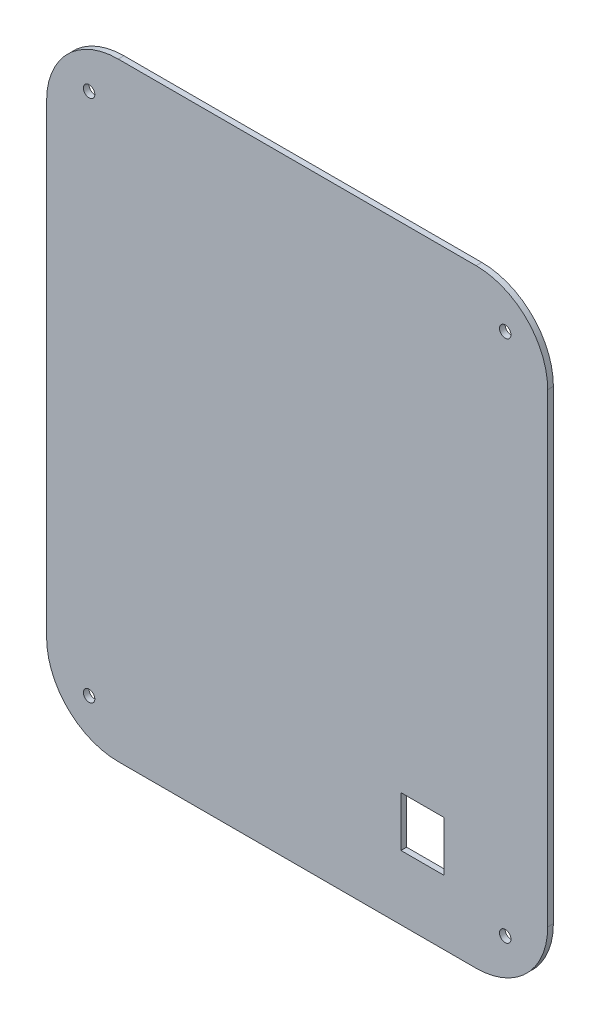
ISO-10303-21;
HEADER;
FILE_DESCRIPTION(('STEP AP214'),'2;1');
FILE_NAME('part.step','',(''),(''),'','','');
FILE_SCHEMA(('AUTOMOTIVE_DESIGN { 1 0 10303 214 1 1 1 1 }'));
ENDSEC;
DATA;
#1=APPLICATION_CONTEXT('core data for automotive mechanical design processes');
#2=APPLICATION_PROTOCOL_DEFINITION('international standard','automotive_design',2000,#1);
#3=PRODUCT_CONTEXT('',#1,'mechanical');
#4=PRODUCT('Part','Part','',(#3));
#5=PRODUCT_RELATED_PRODUCT_CATEGORY('part','',(#4));
#6=PRODUCT_DEFINITION_FORMATION('','',#4);
#7=PRODUCT_DEFINITION_CONTEXT('part definition',#1,'design');
#8=PRODUCT_DEFINITION('design','',#6,#7);
#9=PRODUCT_DEFINITION_SHAPE('','',#8);
#10=(LENGTH_UNIT() NAMED_UNIT(*) SI_UNIT(.MILLI.,.METRE.));
#11=(NAMED_UNIT(*) PLANE_ANGLE_UNIT() SI_UNIT($,.RADIAN.));
#12=(NAMED_UNIT(*) SI_UNIT($,.STERADIAN.) SOLID_ANGLE_UNIT());
#13=UNCERTAINTY_MEASURE_WITH_UNIT(LENGTH_MEASURE(1.E-05),#10,'distance_accuracy_value','');
#14=(GEOMETRIC_REPRESENTATION_CONTEXT(3) GLOBAL_UNCERTAINTY_ASSIGNED_CONTEXT((#13)) GLOBAL_UNIT_ASSIGNED_CONTEXT((#10,
#11,#12)) REPRESENTATION_CONTEXT('',''));
#15=CARTESIAN_POINT('',(0.,0.,0.));
#16=DIRECTION('',(0.,0.,1.));
#17=DIRECTION('',(1.,0.,0.));
#18=AXIS2_PLACEMENT_3D('',#15,#16,#17);
#19=CARTESIAN_POINT('',(52.8773081886998,81.0393473904373,1.5875));
#20=DIRECTION('',(0.,0.,1.));
#21=DIRECTION('',(1.,0.,0.));
#22=AXIS2_PLACEMENT_3D('',#19,#20,#21);
#23=PLANE('',#22);
#24=DIRECTION('',(0.,-1.,0.));
#25=VECTOR('',#24,1.);
#26=CARTESIAN_POINT('',(31.8773081886997,0.,1.5875));
#27=LINE('',#26,#25);
#28=CARTESIAN_POINT('',(31.8773081886997,-36.9606526095627,1.5875));
#29=VERTEX_POINT('',#28);
#30=CARTESIAN_POINT('',(31.8773081886997,-50.9606526095627,1.5875));
#31=VERTEX_POINT('',#30);
#32=EDGE_CURVE('E54',#29,#31,#27,.T.);
#33=ORIENTED_EDGE('',*,*,#32,.F.);
#34=DIRECTION('',(-1.,0.,0.));
#35=VECTOR('',#34,1.);
#36=CARTESIAN_POINT('',(0.,-36.9606526095627,1.5875));
#37=LINE('',#36,#35);
#38=CARTESIAN_POINT('',(43.8773081886997,-36.9606526095627,1.5875));
#39=VERTEX_POINT('',#38);
#40=EDGE_CURVE('E145',#39,#29,#37,.T.);
#41=ORIENTED_EDGE('',*,*,#40,.F.);
#42=DIRECTION('',(0.,-1.,0.));
#43=VECTOR('',#42,1.);
#44=CARTESIAN_POINT('',(43.8773081886997,0.,1.5875));
#45=LINE('',#44,#43);
#46=CARTESIAN_POINT('',(43.8773081886997,-50.9606526095627,1.58750000000002));
#47=VERTEX_POINT('',#46);
#48=EDGE_CURVE('E148',#39,#47,#45,.T.);
#49=ORIENTED_EDGE('',*,*,#48,.T.);
#50=DIRECTION('',(1.,0.,0.));
#51=VECTOR('',#50,1.);
#52=CARTESIAN_POINT('',(0.,-50.9606526095627,1.58750000000002));
#53=LINE('',#52,#51);
#54=EDGE_CURVE('E154',#31,#47,#53,.T.);
#55=ORIENTED_EDGE('',*,*,#54,.F.);
#56=EDGE_LOOP('',(#33,#41,#49,#55));
#57=FACE_BOUND('',#56,.T.);
#58=CARTESIAN_POINT('',(61.0090361723451,89.1710753740826,1.5875));
#59=DIRECTION('',(0.,0.,1.));
#60=DIRECTION('',(1.,0.,0.));
#61=AXIS2_PLACEMENT_3D('',#58,#59,#60);
#62=CIRCLE('',#61,1.60000000000001);
#63=CARTESIAN_POINT('',(62.6090361723451,89.1710753740826,1.5875));
#64=VERTEX_POINT('',#63);
#65=EDGE_CURVE('E170',#64,#64,#62,.T.);
#66=ORIENTED_EDGE('',*,*,#65,.F.);
#67=EDGE_LOOP('',(#66));
#68=FACE_BOUND('',#67,.T.);
#69=CARTESIAN_POINT('',(-55.2544197949455,-57.092380593208,1.5875));
#70=DIRECTION('',(0.,0.,1.));
#71=DIRECTION('',(1.,0.,0.));
#72=AXIS2_PLACEMENT_3D('',#69,#70,#71);
#73=CIRCLE('',#72,1.60000000000001);
#74=CARTESIAN_POINT('',(-53.6544197949455,-57.092380593208,1.5875));
#75=VERTEX_POINT('',#74);
#76=EDGE_CURVE('E182',#75,#75,#73,.T.);
#77=ORIENTED_EDGE('',*,*,#76,.F.);
#78=EDGE_LOOP('',(#77));
#79=FACE_BOUND('',#78,.T.);
#80=CARTESIAN_POINT('',(52.8773081886998,81.0393473904373,1.5875));
#81=DIRECTION('',(0.,0.,1.));
#82=DIRECTION('',(1.,0.,0.));
#83=AXIS2_PLACEMENT_3D('',#80,#81,#82);
#84=CIRCLE('',#83,20.);
#85=CARTESIAN_POINT('',(72.8773081886998,81.0393473904373,1.5875));
#86=VERTEX_POINT('',#85);
#87=CARTESIAN_POINT('',(52.8773081886998,101.039347390437,1.5875));
#88=VERTEX_POINT('',#87);
#89=EDGE_CURVE('E188',#86,#88,#84,.T.);
#90=ORIENTED_EDGE('',*,*,#89,.T.);
#91=DIRECTION('',(-1.,0.,0.));
#92=VECTOR('',#91,1.);
#93=CARTESIAN_POINT('',(52.8773081886998,101.039347390437,1.5875));
#94=LINE('',#93,#92);
#95=CARTESIAN_POINT('',(-47.1226918113002,101.039347390437,1.5875));
#96=VERTEX_POINT('',#95);
#97=EDGE_CURVE('E191',#88,#96,#94,.T.);
#98=ORIENTED_EDGE('',*,*,#97,.T.);
#99=CARTESIAN_POINT('',(-47.1226918113002,81.0393473904373,1.5875));
#100=DIRECTION('',(0.,0.,1.));
#101=DIRECTION('',(1.,0.,0.));
#102=AXIS2_PLACEMENT_3D('',#99,#100,#101);
#103=CIRCLE('',#102,20.);
#104=CARTESIAN_POINT('',(-67.1226918113002,81.0393473904373,1.5875));
#105=VERTEX_POINT('',#104);
#106=EDGE_CURVE('E194',#96,#105,#103,.T.);
#107=ORIENTED_EDGE('',*,*,#106,.T.);
#108=DIRECTION('',(0.,-1.,0.));
#109=VECTOR('',#108,1.);
#110=CARTESIAN_POINT('',(-67.1226918113002,81.0393473904373,1.5875));
#111=LINE('',#110,#109);
#112=CARTESIAN_POINT('',(-67.1226918113003,-48.9606526095627,1.5875));
#113=VERTEX_POINT('',#112);
#114=EDGE_CURVE('E196',#105,#113,#111,.T.);
#115=ORIENTED_EDGE('',*,*,#114,.T.);
#116=CARTESIAN_POINT('',(-47.1226918113003,-48.9606526095627,1.5875));
#117=DIRECTION('',(0.,0.,1.));
#118=DIRECTION('',(1.,0.,0.));
#119=AXIS2_PLACEMENT_3D('',#116,#117,#118);
#120=CIRCLE('',#119,20.);
#121=CARTESIAN_POINT('',(-47.1226918113003,-68.9606526095627,1.5875));
#122=VERTEX_POINT('',#121);
#123=EDGE_CURVE('E198',#113,#122,#120,.T.);
#124=ORIENTED_EDGE('',*,*,#123,.T.);
#125=DIRECTION('',(1.,0.,0.));
#126=VECTOR('',#125,1.);
#127=CARTESIAN_POINT('',(-47.1226918113003,-68.9606526095627,1.5875));
#128=LINE('',#127,#126);
#129=CARTESIAN_POINT('',(52.8773081886997,-68.9606526095627,1.5875));
#130=VERTEX_POINT('',#129);
#131=EDGE_CURVE('E200',#122,#130,#128,.T.);
#132=ORIENTED_EDGE('',*,*,#131,.T.);
#133=CARTESIAN_POINT('',(52.8773081886998,-48.9606526095627,1.5875));
#134=DIRECTION('',(0.,0.,1.));
#135=DIRECTION('',(1.,0.,0.));
#136=AXIS2_PLACEMENT_3D('',#133,#134,#135);
#137=CIRCLE('',#136,20.);
#138=CARTESIAN_POINT('',(72.8773081886998,-48.9606526095627,1.5875));
#139=VERTEX_POINT('',#138);
#140=EDGE_CURVE('E202',#130,#139,#137,.T.);
#141=ORIENTED_EDGE('',*,*,#140,.T.);
#142=DIRECTION('',(0.,1.,0.));
#143=VECTOR('',#142,1.);
#144=CARTESIAN_POINT('',(72.8773081886998,-48.9606526095627,1.5875));
#145=LINE('',#144,#143);
#146=EDGE_CURVE('E204',#139,#86,#145,.T.);
#147=ORIENTED_EDGE('',*,*,#146,.T.);
#148=EDGE_LOOP('',(#90,#98,#107,#115,#124,#132,#141,#147));
#149=FACE_BOUND('',#148,.T.);
#150=CARTESIAN_POINT('',(61.009036172345,-57.092380593208,1.5875));
#151=DIRECTION('',(0.,0.,1.));
#152=DIRECTION('',(1.,0.,0.));
#153=AXIS2_PLACEMENT_3D('',#150,#151,#152);
#154=CIRCLE('',#153,1.60000000000001);
#155=CARTESIAN_POINT('',(62.609036172345,-57.092380593208,1.5875));
#156=VERTEX_POINT('',#155);
#157=EDGE_CURVE('E176',#156,#156,#154,.T.);
#158=ORIENTED_EDGE('',*,*,#157,.F.);
#159=EDGE_LOOP('',(#158));
#160=FACE_BOUND('',#159,.T.);
#161=CARTESIAN_POINT('',(-55.2544197949455,89.1710753740826,1.5875));
#162=DIRECTION('',(0.,0.,1.));
#163=DIRECTION('',(1.,0.,0.));
#164=AXIS2_PLACEMENT_3D('',#161,#162,#163);
#165=CIRCLE('',#164,1.60000000000001);
#166=CARTESIAN_POINT('',(-53.6544197949455,89.1710753740826,1.5875));
#167=VERTEX_POINT('',#166);
#168=EDGE_CURVE('E164',#167,#167,#165,.T.);
#169=ORIENTED_EDGE('',*,*,#168,.F.);
#170=EDGE_LOOP('',(#169));
#171=FACE_BOUND('',#170,.T.);
#172=ADVANCED_FACE('F39',(#57,#68,#79,#149,#160,#171),#23,.T.);
#173=CARTESIAN_POINT('',(52.8773081886998,81.0393473904373,0.));
#174=DIRECTION('',(0.,0.,1.));
#175=DIRECTION('',(1.,0.,0.));
#176=AXIS2_PLACEMENT_3D('',#173,#174,#175);
#177=PLANE('',#176);
#178=DIRECTION('',(-1.,0.,0.));
#179=VECTOR('',#178,1.);
#180=CARTESIAN_POINT('',(0.,-36.9606526095627,0.));
#181=LINE('',#180,#179);
#182=CARTESIAN_POINT('',(43.8773081886997,-36.9606526095627,0.));
#183=VERTEX_POINT('',#182);
#184=CARTESIAN_POINT('',(31.8773081886997,-36.9606526095627,0.));
#185=VERTEX_POINT('',#184);
#186=EDGE_CURVE('E133',#183,#185,#181,.T.);
#187=ORIENTED_EDGE('',*,*,#186,.T.);
#188=DIRECTION('',(0.,-1.,0.));
#189=VECTOR('',#188,1.);
#190=CARTESIAN_POINT('',(31.8773081886997,0.,0.));
#191=LINE('',#190,#189);
#192=CARTESIAN_POINT('',(31.8773081886997,-50.9606526095627,0.));
#193=VERTEX_POINT('',#192);
#194=EDGE_CURVE('E130',#185,#193,#191,.T.);
#195=ORIENTED_EDGE('',*,*,#194,.T.);
#196=DIRECTION('',(1.,0.,0.));
#197=VECTOR('',#196,1.);
#198=CARTESIAN_POINT('',(0.,-50.9606526095627,0.));
#199=LINE('',#198,#197);
#200=CARTESIAN_POINT('',(43.8773081886997,-50.9606526095627,0.));
#201=VERTEX_POINT('',#200);
#202=EDGE_CURVE('E136',#193,#201,#199,.T.);
#203=ORIENTED_EDGE('',*,*,#202,.T.);
#204=DIRECTION('',(0.,-1.,0.));
#205=VECTOR('',#204,1.);
#206=CARTESIAN_POINT('',(43.8773081886997,0.,0.));
#207=LINE('',#206,#205);
#208=EDGE_CURVE('E140',#183,#201,#207,.T.);
#209=ORIENTED_EDGE('',*,*,#208,.F.);
#210=EDGE_LOOP('',(#187,#195,#203,#209));
#211=FACE_BOUND('',#210,.T.);
#212=CARTESIAN_POINT('',(52.8773081886998,81.0393473904373,0.));
#213=DIRECTION('',(0.,0.,1.));
#214=DIRECTION('',(1.,0.,0.));
#215=AXIS2_PLACEMENT_3D('',#212,#213,#214);
#216=CIRCLE('',#215,20.);
#217=CARTESIAN_POINT('',(72.8773081886998,81.0393473904373,0.));
#218=VERTEX_POINT('',#217);
#219=CARTESIAN_POINT('',(52.8773081886998,101.039347390437,0.));
#220=VERTEX_POINT('',#219);
#221=EDGE_CURVE('E185',#218,#220,#216,.T.);
#222=ORIENTED_EDGE('',*,*,#221,.F.);
#223=DIRECTION('',(0.,1.,0.));
#224=VECTOR('',#223,1.);
#225=CARTESIAN_POINT('',(72.8773081886998,-48.9606526095627,0.));
#226=LINE('',#225,#224);
#227=CARTESIAN_POINT('',(72.8773081886998,-48.9606526095627,0.));
#228=VERTEX_POINT('',#227);
#229=EDGE_CURVE('E192',#228,#218,#226,.T.);
#230=ORIENTED_EDGE('',*,*,#229,.F.);
#231=CARTESIAN_POINT('',(52.8773081886998,-48.9606526095627,0.));
#232=DIRECTION('',(0.,0.,1.));
#233=DIRECTION('',(1.,0.,0.));
#234=AXIS2_PLACEMENT_3D('',#231,#232,#233);
#235=CIRCLE('',#234,20.);
#236=CARTESIAN_POINT('',(52.8773081886997,-68.9606526095627,0.));
#237=VERTEX_POINT('',#236);
#238=EDGE_CURVE('E219',#237,#228,#235,.T.);
#239=ORIENTED_EDGE('',*,*,#238,.F.);
#240=DIRECTION('',(1.,0.,0.));
#241=VECTOR('',#240,1.);
#242=CARTESIAN_POINT('',(-47.1226918113003,-68.9606526095627,0.));
#243=LINE('',#242,#241);
#244=CARTESIAN_POINT('',(-47.1226918113003,-68.9606526095627,0.));
#245=VERTEX_POINT('',#244);
#246=EDGE_CURVE('E217',#245,#237,#243,.T.);
#247=ORIENTED_EDGE('',*,*,#246,.F.);
#248=CARTESIAN_POINT('',(-47.1226918113003,-48.9606526095627,0.));
#249=DIRECTION('',(0.,0.,1.));
#250=DIRECTION('',(1.,0.,0.));
#251=AXIS2_PLACEMENT_3D('',#248,#249,#250);
#252=CIRCLE('',#251,20.);
#253=CARTESIAN_POINT('',(-67.1226918113003,-48.9606526095627,0.));
#254=VERTEX_POINT('',#253);
#255=EDGE_CURVE('E215',#254,#245,#252,.T.);
#256=ORIENTED_EDGE('',*,*,#255,.F.);
#257=DIRECTION('',(0.,-1.,0.));
#258=VECTOR('',#257,1.);
#259=CARTESIAN_POINT('',(-67.1226918113002,81.0393473904373,0.));
#260=LINE('',#259,#258);
#261=CARTESIAN_POINT('',(-67.1226918113002,81.0393473904373,0.));
#262=VERTEX_POINT('',#261);
#263=EDGE_CURVE('E213',#262,#254,#260,.T.);
#264=ORIENTED_EDGE('',*,*,#263,.F.);
#265=CARTESIAN_POINT('',(-47.1226918113002,81.0393473904373,0.));
#266=DIRECTION('',(0.,0.,1.));
#267=DIRECTION('',(1.,0.,0.));
#268=AXIS2_PLACEMENT_3D('',#265,#266,#267);
#269=CIRCLE('',#268,20.);
#270=CARTESIAN_POINT('',(-47.1226918113002,101.039347390437,0.));
#271=VERTEX_POINT('',#270);
#272=EDGE_CURVE('E211',#271,#262,#269,.T.);
#273=ORIENTED_EDGE('',*,*,#272,.F.);
#274=DIRECTION('',(-1.,0.,0.));
#275=VECTOR('',#274,1.);
#276=CARTESIAN_POINT('',(52.8773081886998,101.039347390437,0.));
#277=LINE('',#276,#275);
#278=EDGE_CURVE('E209',#220,#271,#277,.T.);
#279=ORIENTED_EDGE('',*,*,#278,.F.);
#280=EDGE_LOOP('',(#222,#230,#239,#247,#256,#264,#273,#279));
#281=FACE_BOUND('',#280,.T.);
#282=CARTESIAN_POINT('',(-55.2544197949455,-57.092380593208,0.));
#283=DIRECTION('',(0.,0.,1.));
#284=DIRECTION('',(1.,0.,0.));
#285=AXIS2_PLACEMENT_3D('',#282,#283,#284);
#286=CIRCLE('',#285,1.60000000000001);
#287=CARTESIAN_POINT('',(-53.6544197949455,-57.092380593208,0.));
#288=VERTEX_POINT('',#287);
#289=EDGE_CURVE('E179',#288,#288,#286,.T.);
#290=ORIENTED_EDGE('',*,*,#289,.T.);
#291=EDGE_LOOP('',(#290));
#292=FACE_BOUND('',#291,.T.);
#293=CARTESIAN_POINT('',(61.009036172345,-57.092380593208,0.));
#294=DIRECTION('',(0.,0.,1.));
#295=DIRECTION('',(1.,0.,0.));
#296=AXIS2_PLACEMENT_3D('',#293,#294,#295);
#297=CIRCLE('',#296,1.60000000000001);
#298=CARTESIAN_POINT('',(62.609036172345,-57.092380593208,0.));
#299=VERTEX_POINT('',#298);
#300=EDGE_CURVE('E173',#299,#299,#297,.T.);
#301=ORIENTED_EDGE('',*,*,#300,.T.);
#302=EDGE_LOOP('',(#301));
#303=FACE_BOUND('',#302,.T.);
#304=CARTESIAN_POINT('',(61.0090361723451,89.1710753740826,0.));
#305=DIRECTION('',(0.,0.,1.));
#306=DIRECTION('',(1.,0.,0.));
#307=AXIS2_PLACEMENT_3D('',#304,#305,#306);
#308=CIRCLE('',#307,1.60000000000001);
#309=CARTESIAN_POINT('',(62.6090361723451,89.1710753740826,0.));
#310=VERTEX_POINT('',#309);
#311=EDGE_CURVE('E167',#310,#310,#308,.T.);
#312=ORIENTED_EDGE('',*,*,#311,.T.);
#313=EDGE_LOOP('',(#312));
#314=FACE_BOUND('',#313,.T.);
#315=CARTESIAN_POINT('',(-55.2544197949455,89.1710753740826,0.));
#316=DIRECTION('',(0.,0.,1.));
#317=DIRECTION('',(1.,0.,0.));
#318=AXIS2_PLACEMENT_3D('',#315,#316,#317);
#319=CIRCLE('',#318,1.60000000000001);
#320=CARTESIAN_POINT('',(-53.6544197949455,89.1710753740826,0.));
#321=VERTEX_POINT('',#320);
#322=EDGE_CURVE('E160',#321,#321,#319,.T.);
#323=ORIENTED_EDGE('',*,*,#322,.T.);
#324=EDGE_LOOP('',(#323));
#325=FACE_BOUND('',#324,.T.);
#326=ADVANCED_FACE('F142',(#211,#281,#292,#303,#314,#325),#177,.F.);
#327=CARTESIAN_POINT('',(52.8773081886998,81.0393473904373,1.5875));
#328=DIRECTION('',(0.,0.,-1.));
#329=DIRECTION('',(-1.,0.,0.));
#330=AXIS2_PLACEMENT_3D('',#327,#328,#329);
#331=CYLINDRICAL_SURFACE('',#330,20.);
#332=ORIENTED_EDGE('',*,*,#221,.T.);
#333=DIRECTION('',(0.,0.,-1.));
#334=VECTOR('',#333,1.);
#335=CARTESIAN_POINT('',(52.8773081886998,101.039347390437,1.5875));
#336=LINE('',#335,#334);
#337=EDGE_CURVE('E11',#88,#220,#336,.T.);
#338=ORIENTED_EDGE('',*,*,#337,.F.);
#339=ORIENTED_EDGE('',*,*,#89,.F.);
#340=DIRECTION('',(0.,0.,-1.));
#341=VECTOR('',#340,1.);
#342=CARTESIAN_POINT('',(72.8773081886998,81.0393473904373,1.5875));
#343=LINE('',#342,#341);
#344=EDGE_CURVE('E206',#86,#218,#343,.T.);
#345=ORIENTED_EDGE('',*,*,#344,.T.);
#346=EDGE_LOOP('',(#332,#338,#339,#345));
#347=FACE_BOUND('',#346,.T.);
#348=ADVANCED_FACE('F41',(#347),#331,.T.);
#349=CARTESIAN_POINT('',(52.8773081886998,101.039347390437,1.5875));
#350=DIRECTION('',(0.,-1.,0.));
#351=DIRECTION('',(0.,0.,-1.));
#352=AXIS2_PLACEMENT_3D('',#349,#350,#351);
#353=PLANE('',#352);
#354=ORIENTED_EDGE('',*,*,#278,.T.);
#355=DIRECTION('',(0.,0.,-1.));
#356=VECTOR('',#355,1.);
#357=CARTESIAN_POINT('',(-47.1226918113002,101.039347390437,1.5875));
#358=LINE('',#357,#356);
#359=EDGE_CURVE('E47',#96,#271,#358,.T.);
#360=ORIENTED_EDGE('',*,*,#359,.F.);
#361=ORIENTED_EDGE('',*,*,#97,.F.);
#362=ORIENTED_EDGE('',*,*,#337,.T.);
#363=EDGE_LOOP('',(#354,#360,#361,#362));
#364=FACE_BOUND('',#363,.T.);
#365=ADVANCED_FACE('F265',(#364),#353,.F.);
#366=CARTESIAN_POINT('',(-47.1226918113002,81.0393473904373,1.5875));
#367=DIRECTION('',(0.,0.,-1.));
#368=DIRECTION('',(-1.,0.,0.));
#369=AXIS2_PLACEMENT_3D('',#366,#367,#368);
#370=CYLINDRICAL_SURFACE('',#369,20.);
#371=ORIENTED_EDGE('',*,*,#272,.T.);
#372=DIRECTION('',(0.,0.,-1.));
#373=VECTOR('',#372,1.);
#374=CARTESIAN_POINT('',(-67.1226918113002,81.0393473904373,1.5875));
#375=LINE('',#374,#373);
#376=EDGE_CURVE('E236',#105,#262,#375,.T.);
#377=ORIENTED_EDGE('',*,*,#376,.F.);
#378=ORIENTED_EDGE('',*,*,#106,.F.);
#379=ORIENTED_EDGE('',*,*,#359,.T.);
#380=EDGE_LOOP('',(#371,#377,#378,#379));
#381=FACE_BOUND('',#380,.T.);
#382=ADVANCED_FACE('F243',(#381),#370,.T.);
#383=CARTESIAN_POINT('',(-67.1226918113002,81.0393473904373,1.5875));
#384=DIRECTION('',(1.,0.,0.));
#385=DIRECTION('',(0.,1.,0.));
#386=AXIS2_PLACEMENT_3D('',#383,#384,#385);
#387=PLANE('',#386);
#388=ORIENTED_EDGE('',*,*,#263,.T.);
#389=DIRECTION('',(0.,0.,-1.));
#390=VECTOR('',#389,1.);
#391=CARTESIAN_POINT('',(-67.1226918113003,-48.9606526095627,1.5875));
#392=LINE('',#391,#390);
#393=EDGE_CURVE('E233',#113,#254,#392,.T.);
#394=ORIENTED_EDGE('',*,*,#393,.F.);
#395=ORIENTED_EDGE('',*,*,#114,.F.);
#396=ORIENTED_EDGE('',*,*,#376,.T.);
#397=EDGE_LOOP('',(#388,#394,#395,#396));
#398=FACE_BOUND('',#397,.T.);
#399=ADVANCED_FACE('F253',(#398),#387,.F.);
#400=CARTESIAN_POINT('',(-47.1226918113003,-48.9606526095627,1.5875));
#401=DIRECTION('',(0.,0.,-1.));
#402=DIRECTION('',(-1.,0.,0.));
#403=AXIS2_PLACEMENT_3D('',#400,#401,#402);
#404=CYLINDRICAL_SURFACE('',#403,20.);
#405=ORIENTED_EDGE('',*,*,#255,.T.);
#406=DIRECTION('',(0.,0.,-1.));
#407=VECTOR('',#406,1.);
#408=CARTESIAN_POINT('',(-47.1226918113003,-68.9606526095627,1.5875));
#409=LINE('',#408,#407);
#410=EDGE_CURVE('E230',#122,#245,#409,.T.);
#411=ORIENTED_EDGE('',*,*,#410,.F.);
#412=ORIENTED_EDGE('',*,*,#123,.F.);
#413=ORIENTED_EDGE('',*,*,#393,.T.);
#414=EDGE_LOOP('',(#405,#411,#412,#413));
#415=FACE_BOUND('',#414,.T.);
#416=ADVANCED_FACE('F257',(#415),#404,.T.);
#417=CARTESIAN_POINT('',(-47.1226918113003,-68.9606526095627,1.5875));
#418=DIRECTION('',(0.,1.,0.));
#419=DIRECTION('',(0.,0.,1.));
#420=AXIS2_PLACEMENT_3D('',#417,#418,#419);
#421=PLANE('',#420);
#422=ORIENTED_EDGE('',*,*,#246,.T.);
#423=DIRECTION('',(0.,0.,-1.));
#424=VECTOR('',#423,1.);
#425=CARTESIAN_POINT('',(52.8773081886997,-68.9606526095627,1.5875));
#426=LINE('',#425,#424);
#427=EDGE_CURVE('E227',#130,#237,#426,.T.);
#428=ORIENTED_EDGE('',*,*,#427,.F.);
#429=ORIENTED_EDGE('',*,*,#131,.F.);
#430=ORIENTED_EDGE('',*,*,#410,.T.);
#431=EDGE_LOOP('',(#422,#428,#429,#430));
#432=FACE_BOUND('',#431,.T.);
#433=ADVANCED_FACE('F278',(#432),#421,.F.);
#434=CARTESIAN_POINT('',(52.8773081886998,-48.9606526095627,1.5875));
#435=DIRECTION('',(0.,0.,-1.));
#436=DIRECTION('',(-1.,0.,0.));
#437=AXIS2_PLACEMENT_3D('',#434,#435,#436);
#438=CYLINDRICAL_SURFACE('',#437,20.);
#439=ORIENTED_EDGE('',*,*,#238,.T.);
#440=DIRECTION('',(0.,0.,-1.));
#441=VECTOR('',#440,1.);
#442=CARTESIAN_POINT('',(72.8773081886998,-48.9606526095627,1.5875));
#443=LINE('',#442,#441);
#444=EDGE_CURVE('E224',#139,#228,#443,.T.);
#445=ORIENTED_EDGE('',*,*,#444,.F.);
#446=ORIENTED_EDGE('',*,*,#140,.F.);
#447=ORIENTED_EDGE('',*,*,#427,.T.);
#448=EDGE_LOOP('',(#439,#445,#446,#447));
#449=FACE_BOUND('',#448,.T.);
#450=ADVANCED_FACE('F276',(#449),#438,.T.);
#451=CARTESIAN_POINT('',(72.8773081886998,-48.9606526095627,1.5875));
#452=DIRECTION('',(-1.,0.,0.));
#453=DIRECTION('',(0.,-1.,0.));
#454=AXIS2_PLACEMENT_3D('',#451,#452,#453);
#455=PLANE('',#454);
#456=ORIENTED_EDGE('',*,*,#229,.T.);
#457=ORIENTED_EDGE('',*,*,#344,.F.);
#458=ORIENTED_EDGE('',*,*,#146,.F.);
#459=ORIENTED_EDGE('',*,*,#444,.T.);
#460=EDGE_LOOP('',(#456,#457,#458,#459));
#461=FACE_BOUND('',#460,.T.);
#462=ADVANCED_FACE('F271',(#461),#455,.F.);
#463=CARTESIAN_POINT('',(-55.2544197949455,-57.092380593208,1.5875));
#464=DIRECTION('',(0.,0.,-1.));
#465=DIRECTION('',(-1.,0.,0.));
#466=AXIS2_PLACEMENT_3D('',#463,#464,#465);
#467=CYLINDRICAL_SURFACE('',#466,1.60000000000001);
#468=ORIENTED_EDGE('',*,*,#76,.T.);
#469=EDGE_LOOP('',(#468));
#470=FACE_BOUND('',#469,.T.);
#471=ORIENTED_EDGE('',*,*,#289,.F.);
#472=EDGE_LOOP('',(#471));
#473=FACE_BOUND('',#472,.T.);
#474=ADVANCED_FACE('F297',(#470,#473),#467,.F.);
#475=CARTESIAN_POINT('',(61.009036172345,-57.092380593208,1.5875));
#476=DIRECTION('',(0.,0.,-1.));
#477=DIRECTION('',(-1.,0.,0.));
#478=AXIS2_PLACEMENT_3D('',#475,#476,#477);
#479=CYLINDRICAL_SURFACE('',#478,1.60000000000001);
#480=ORIENTED_EDGE('',*,*,#157,.T.);
#481=EDGE_LOOP('',(#480));
#482=FACE_BOUND('',#481,.T.);
#483=ORIENTED_EDGE('',*,*,#300,.F.);
#484=EDGE_LOOP('',(#483));
#485=FACE_BOUND('',#484,.T.);
#486=ADVANCED_FACE('F304',(#482,#485),#479,.F.);
#487=CARTESIAN_POINT('',(61.0090361723451,89.1710753740826,1.5875));
#488=DIRECTION('',(0.,0.,-1.));
#489=DIRECTION('',(-1.,0.,0.));
#490=AXIS2_PLACEMENT_3D('',#487,#488,#489);
#491=CYLINDRICAL_SURFACE('',#490,1.60000000000001);
#492=ORIENTED_EDGE('',*,*,#65,.T.);
#493=EDGE_LOOP('',(#492));
#494=FACE_BOUND('',#493,.T.);
#495=ORIENTED_EDGE('',*,*,#311,.F.);
#496=EDGE_LOOP('',(#495));
#497=FACE_BOUND('',#496,.T.);
#498=ADVANCED_FACE('F309',(#494,#497),#491,.F.);
#499=CARTESIAN_POINT('',(-55.2544197949455,89.1710753740826,1.5875));
#500=DIRECTION('',(0.,0.,-1.));
#501=DIRECTION('',(-1.,0.,0.));
#502=AXIS2_PLACEMENT_3D('',#499,#500,#501);
#503=CYLINDRICAL_SURFACE('',#502,1.60000000000001);
#504=ORIENTED_EDGE('',*,*,#168,.T.);
#505=EDGE_LOOP('',(#504));
#506=FACE_BOUND('',#505,.T.);
#507=ORIENTED_EDGE('',*,*,#322,.F.);
#508=EDGE_LOOP('',(#507));
#509=FACE_BOUND('',#508,.T.);
#510=ADVANCED_FACE('F321',(#506,#509),#503,.F.);
#511=CARTESIAN_POINT('',(31.8773081886997,0.,0.));
#512=DIRECTION('',(-1.,0.,0.));
#513=DIRECTION('',(0.,0.,1.));
#514=AXIS2_PLACEMENT_3D('',#511,#512,#513);
#515=PLANE('',#514);
#516=ORIENTED_EDGE('',*,*,#32,.T.);
#517=DIRECTION('',(0.,0.,1.));
#518=VECTOR('',#517,1.);
#519=CARTESIAN_POINT('',(31.8773081886997,-50.9606526095627,0.));
#520=LINE('',#519,#518);
#521=EDGE_CURVE('E127',#193,#31,#520,.T.);
#522=ORIENTED_EDGE('',*,*,#521,.F.);
#523=ORIENTED_EDGE('',*,*,#194,.F.);
#524=DIRECTION('',(0.,0.,1.));
#525=VECTOR('',#524,1.);
#526=CARTESIAN_POINT('',(31.8773081886997,-36.9606526095627,0.));
#527=LINE('',#526,#525);
#528=EDGE_CURVE('E158',#185,#29,#527,.T.);
#529=ORIENTED_EDGE('',*,*,#528,.T.);
#530=EDGE_LOOP('',(#516,#522,#523,#529));
#531=FACE_BOUND('',#530,.T.);
#532=ADVANCED_FACE('F128',(#531),#515,.F.);
#533=CARTESIAN_POINT('',(0.,-36.9606526095627,0.));
#534=DIRECTION('',(0.,1.,0.));
#535=DIRECTION('',(0.,0.,1.));
#536=AXIS2_PLACEMENT_3D('',#533,#534,#535);
#537=PLANE('',#536);
#538=ORIENTED_EDGE('',*,*,#40,.T.);
#539=ORIENTED_EDGE('',*,*,#528,.F.);
#540=ORIENTED_EDGE('',*,*,#186,.F.);
#541=DIRECTION('',(0.,0.,1.));
#542=VECTOR('',#541,1.);
#543=CARTESIAN_POINT('',(43.8773081886997,-36.9606526095627,0.));
#544=LINE('',#543,#542);
#545=EDGE_CURVE('E161',#183,#39,#544,.T.);
#546=ORIENTED_EDGE('',*,*,#545,.T.);
#547=EDGE_LOOP('',(#538,#539,#540,#546));
#548=FACE_BOUND('',#547,.T.);
#549=ADVANCED_FACE('F328',(#548),#537,.F.);
#550=CARTESIAN_POINT('',(43.8773081886997,0.,0.));
#551=DIRECTION('',(-1.,0.,0.));
#552=DIRECTION('',(0.,0.,1.));
#553=AXIS2_PLACEMENT_3D('',#550,#551,#552);
#554=PLANE('',#553);
#555=ORIENTED_EDGE('',*,*,#48,.F.);
#556=ORIENTED_EDGE('',*,*,#545,.F.);
#557=ORIENTED_EDGE('',*,*,#208,.T.);
#558=DIRECTION('',(0.,0.,1.));
#559=VECTOR('',#558,1.);
#560=CARTESIAN_POINT('',(43.8773081886997,-50.9606526095627,0.));
#561=LINE('',#560,#559);
#562=EDGE_CURVE('E62',#201,#47,#561,.T.);
#563=ORIENTED_EDGE('',*,*,#562,.T.);
#564=EDGE_LOOP('',(#555,#556,#557,#563));
#565=FACE_BOUND('',#564,.T.);
#566=ADVANCED_FACE('F335',(#565),#554,.T.);
#567=CARTESIAN_POINT('',(0.,-50.9606526095627,0.));
#568=DIRECTION('',(0.,-1.,0.));
#569=DIRECTION('',(0.,0.,-1.));
#570=AXIS2_PLACEMENT_3D('',#567,#568,#569);
#571=PLANE('',#570);
#572=ORIENTED_EDGE('',*,*,#54,.T.);
#573=ORIENTED_EDGE('',*,*,#562,.F.);
#574=ORIENTED_EDGE('',*,*,#202,.F.);
#575=ORIENTED_EDGE('',*,*,#521,.T.);
#576=EDGE_LOOP('',(#572,#573,#574,#575));
#577=FACE_BOUND('',#576,.T.);
#578=ADVANCED_FACE('F137',(#577),#571,.F.);
#579=CLOSED_SHELL('',(#172,#326,#348,#365,#382,#399,#416,#433,#450,#462,#474,#486,#498,#510,
#532,#549,#566,#578));
#580=MANIFOLD_SOLID_BREP('B2',#579);
#581=ADVANCED_BREP_SHAPE_REPRESENTATION('',(#18,#580),#14);
#582=SHAPE_DEFINITION_REPRESENTATION(#9,#581);
ENDSEC;
END-ISO-10303-21;
